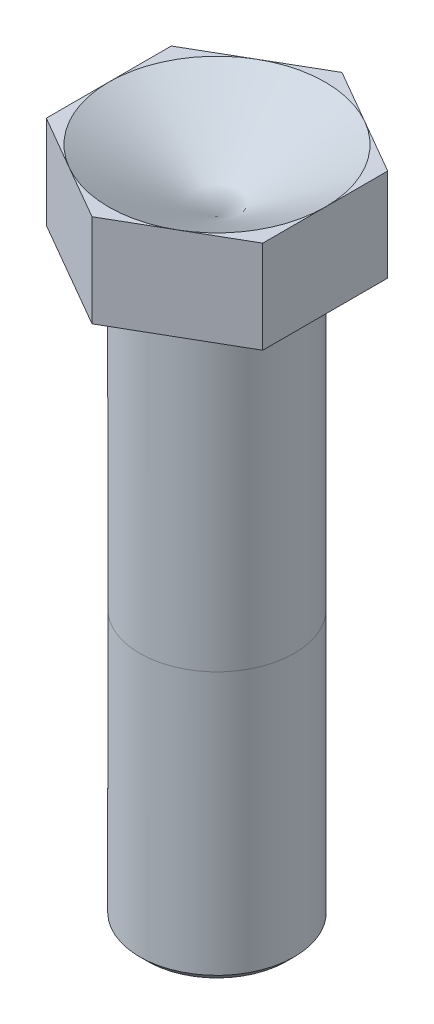
ISO-10303-21;
HEADER;
FILE_DESCRIPTION(('STEP AP214'),'2;1');
FILE_NAME('part.step','',(''),(''),'','','');
FILE_SCHEMA(('AUTOMOTIVE_DESIGN { 1 0 10303 214 1 1 1 1 }'));
ENDSEC;
DATA;
#1=APPLICATION_CONTEXT('core data for automotive mechanical design processes');
#2=APPLICATION_PROTOCOL_DEFINITION('international standard','automotive_design',2000,#1);
#3=PRODUCT_CONTEXT('',#1,'mechanical');
#4=PRODUCT('Part','Part','',(#3));
#5=PRODUCT_RELATED_PRODUCT_CATEGORY('part','',(#4));
#6=PRODUCT_DEFINITION_FORMATION('','',#4);
#7=PRODUCT_DEFINITION_CONTEXT('part definition',#1,'design');
#8=PRODUCT_DEFINITION('design','',#6,#7);
#9=PRODUCT_DEFINITION_SHAPE('','',#8);
#10=(LENGTH_UNIT() NAMED_UNIT(*) SI_UNIT(.MILLI.,.METRE.));
#11=(NAMED_UNIT(*) PLANE_ANGLE_UNIT() SI_UNIT($,.RADIAN.));
#12=(NAMED_UNIT(*) SI_UNIT($,.STERADIAN.) SOLID_ANGLE_UNIT());
#13=UNCERTAINTY_MEASURE_WITH_UNIT(LENGTH_MEASURE(1.E-05),#10,'distance_accuracy_value','');
#14=(GEOMETRIC_REPRESENTATION_CONTEXT(3) GLOBAL_UNCERTAINTY_ASSIGNED_CONTEXT((#13)) GLOBAL_UNIT_ASSIGNED_CONTEXT((#10,
#11,#12)) REPRESENTATION_CONTEXT('',''));
#15=CARTESIAN_POINT('',(0.,0.,0.));
#16=DIRECTION('',(0.,0.,1.));
#17=DIRECTION('',(1.,0.,0.));
#18=AXIS2_PLACEMENT_3D('',#15,#16,#17);
#19=CARTESIAN_POINT('',(0.,-75.,0.));
#20=DIRECTION('',(0.,1.,0.));
#21=DIRECTION('',(0.,0.,1.));
#22=AXIS2_PLACEMENT_3D('',#19,#20,#21);
#23=CYLINDRICAL_SURFACE('',#22,10.);
#24=CARTESIAN_POINT('',(0.,-74.,0.));
#25=DIRECTION('',(0.,-1.,0.));
#26=DIRECTION('',(0.,0.,-1.));
#27=AXIS2_PLACEMENT_3D('',#24,#25,#26);
#28=CIRCLE('',#27,10.);
#29=CARTESIAN_POINT('',(0.,-74.,-10.));
#30=VERTEX_POINT('',#29);
#31=EDGE_CURVE('E222',#30,#30,#28,.F.);
#32=ORIENTED_EDGE('',*,*,#31,.T.);
#33=EDGE_LOOP('',(#32));
#34=FACE_BOUND('',#33,.T.);
#35=CARTESIAN_POINT('',(0.,-40.,0.));
#36=DIRECTION('',(0.,1.,0.));
#37=DIRECTION('',(0.,0.,1.));
#38=AXIS2_PLACEMENT_3D('',#35,#36,#37);
#39=CIRCLE('',#38,10.);
#40=CARTESIAN_POINT('',(10.,-40.,0.));
#41=VERTEX_POINT('',#40);
#42=CARTESIAN_POINT('',(-10.,-40.,0.));
#43=VERTEX_POINT('',#42);
#44=EDGE_CURVE('E13',#41,#43,#39,.T.);
#45=ORIENTED_EDGE('',*,*,#44,.F.);
#46=EDGE_CURVE('E63',#43,#41,#39,.T.);
#47=ORIENTED_EDGE('',*,*,#46,.F.);
#48=EDGE_LOOP('',(#45,#47));
#49=FACE_BOUND('',#48,.T.);
#50=ADVANCED_FACE('F58',(#34,#49),#23,.T.);
#51=CARTESIAN_POINT('',(0.,12.,0.));
#52=DIRECTION('',(0.,1.,0.));
#53=DIRECTION('',(0.,0.,1.));
#54=AXIS2_PLACEMENT_3D('',#51,#52,#53);
#55=PLANE('',#54);
#56=CARTESIAN_POINT('',(0.,12.,0.));
#57=DIRECTION('',(0.,1.,0.));
#58=DIRECTION('',(0.,0.,1.));
#59=AXIS2_PLACEMENT_3D('',#56,#57,#58);
#60=CIRCLE('',#59,14.);
#61=CARTESIAN_POINT('',(7.,12.,12.1243556529821));
#62=VERTEX_POINT('',#61);
#63=CARTESIAN_POINT('',(14.,12.,0.));
#64=VERTEX_POINT('',#63);
#65=EDGE_CURVE('E140',#62,#64,#60,.T.);
#66=ORIENTED_EDGE('',*,*,#65,.F.);
#67=DIRECTION('',(0.866025403784439,0.,-0.5));
#68=VECTOR('',#67,1.);
#69=CARTESIAN_POINT('',(0.,12.,16.1658075373095));
#70=LINE('',#69,#68);
#71=CARTESIAN_POINT('',(14.,12.,8.08290376865476));
#72=VERTEX_POINT('',#71);
#73=EDGE_CURVE('E173',#62,#72,#70,.T.);
#74=ORIENTED_EDGE('',*,*,#73,.T.);
#75=DIRECTION('',(0.,0.,-1.));
#76=VECTOR('',#75,1.);
#77=CARTESIAN_POINT('',(14.,12.,8.08290376865476));
#78=LINE('',#77,#76);
#79=EDGE_CURVE('E167',#72,#64,#78,.T.);
#80=ORIENTED_EDGE('',*,*,#79,.T.);
#81=EDGE_LOOP('',(#66,#74,#80));
#82=FACE_BOUND('',#81,.T.);
#83=ADVANCED_FACE('F172',(#82),#55,.T.);
#84=CARTESIAN_POINT('',(0.,12.,0.));
#85=DIRECTION('',(0.,1.,0.));
#86=DIRECTION('',(0.,0.,1.));
#87=AXIS2_PLACEMENT_3D('',#84,#85,#86);
#88=CIRCLE('',#87,14.);
#89=CARTESIAN_POINT('',(7.,12.,-12.1243556529821));
#90=VERTEX_POINT('',#89);
#91=EDGE_CURVE('E142',#64,#90,#88,.T.);
#92=ORIENTED_EDGE('',*,*,#91,.F.);
#93=CARTESIAN_POINT('',(14.,12.,-8.08290376865476));
#94=VERTEX_POINT('',#93);
#95=EDGE_CURVE('E155',#64,#94,#78,.T.);
#96=ORIENTED_EDGE('',*,*,#95,.T.);
#97=DIRECTION('',(-0.866025403784439,0.,-0.5));
#98=VECTOR('',#97,1.);
#99=CARTESIAN_POINT('',(14.,12.,-8.08290376865476));
#100=LINE('',#99,#98);
#101=EDGE_CURVE('E157',#94,#90,#100,.T.);
#102=ORIENTED_EDGE('',*,*,#101,.T.);
#103=EDGE_LOOP('',(#92,#96,#102));
#104=FACE_BOUND('',#103,.T.);
#105=ADVANCED_FACE('F154',(#104),#55,.T.);
#106=CARTESIAN_POINT('',(-7.,12.,-12.1243556529821));
#107=VERTEX_POINT('',#106);
#108=EDGE_CURVE('E159',#90,#107,#88,.T.);
#109=ORIENTED_EDGE('',*,*,#108,.F.);
#110=CARTESIAN_POINT('',(0.,12.,-16.1658075373095));
#111=VERTEX_POINT('',#110);
#112=EDGE_CURVE('E175',#90,#111,#100,.T.);
#113=ORIENTED_EDGE('',*,*,#112,.T.);
#114=DIRECTION('',(-0.866025403784439,0.,0.5));
#115=VECTOR('',#114,1.);
#116=CARTESIAN_POINT('',(0.,12.,-16.1658075373095));
#117=LINE('',#116,#115);
#118=EDGE_CURVE('E180',#111,#107,#117,.T.);
#119=ORIENTED_EDGE('',*,*,#118,.T.);
#120=EDGE_LOOP('',(#109,#113,#119));
#121=FACE_BOUND('',#120,.T.);
#122=ADVANCED_FACE('F372',(#121),#55,.T.);
#123=CARTESIAN_POINT('',(-14.,12.,0.));
#124=VERTEX_POINT('',#123);
#125=EDGE_CURVE('E400',#107,#124,#88,.T.);
#126=ORIENTED_EDGE('',*,*,#125,.F.);
#127=CARTESIAN_POINT('',(-14.,12.,-8.08290376865475));
#128=VERTEX_POINT('',#127);
#129=EDGE_CURVE('E179',#107,#128,#117,.T.);
#130=ORIENTED_EDGE('',*,*,#129,.T.);
#131=DIRECTION('',(0.,0.,1.));
#132=VECTOR('',#131,1.);
#133=CARTESIAN_POINT('',(-14.,12.,-8.08290376865475));
#134=LINE('',#133,#132);
#135=EDGE_CURVE('E184',#128,#124,#134,.T.);
#136=ORIENTED_EDGE('',*,*,#135,.T.);
#137=EDGE_LOOP('',(#126,#130,#136));
#138=FACE_BOUND('',#137,.T.);
#139=ADVANCED_FACE('F363',(#138),#55,.T.);
#140=CARTESIAN_POINT('',(-7.,12.,12.1243556529821));
#141=VERTEX_POINT('',#140);
#142=EDGE_CURVE('E219',#124,#141,#88,.T.);
#143=ORIENTED_EDGE('',*,*,#142,.F.);
#144=CARTESIAN_POINT('',(-14.,12.,8.08290376865477));
#145=VERTEX_POINT('',#144);
#146=EDGE_CURVE('E183',#124,#145,#134,.T.);
#147=ORIENTED_EDGE('',*,*,#146,.T.);
#148=DIRECTION('',(0.866025403784439,0.,0.5));
#149=VECTOR('',#148,1.);
#150=CARTESIAN_POINT('',(-14.,12.,8.08290376865477));
#151=LINE('',#150,#149);
#152=EDGE_CURVE('E188',#145,#141,#151,.T.);
#153=ORIENTED_EDGE('',*,*,#152,.T.);
#154=EDGE_LOOP('',(#143,#147,#153));
#155=FACE_BOUND('',#154,.T.);
#156=ADVANCED_FACE('F300',(#155),#55,.T.);
#157=CARTESIAN_POINT('',(14.,12.,8.08290376865476));
#158=DIRECTION('',(-1.,0.,0.));
#159=DIRECTION('',(0.,0.,1.));
#160=AXIS2_PLACEMENT_3D('',#157,#158,#159);
#161=PLANE('',#160);
#162=DIRECTION('',(0.,0.,-1.));
#163=VECTOR('',#162,1.);
#164=CARTESIAN_POINT('',(14.,0.,8.08290376865476));
#165=LINE('',#164,#163);
#166=CARTESIAN_POINT('',(14.,0.,8.08290376865476));
#167=VERTEX_POINT('',#166);
#168=CARTESIAN_POINT('',(14.,0.,-8.08290376865476));
#169=VERTEX_POINT('',#168);
#170=EDGE_CURVE('E149',#167,#169,#165,.T.);
#171=ORIENTED_EDGE('',*,*,#170,.T.);
#172=DIRECTION('',(0.,-1.,0.));
#173=VECTOR('',#172,1.);
#174=CARTESIAN_POINT('',(14.,12.,-8.08290376865476));
#175=LINE('',#174,#173);
#176=EDGE_CURVE('E169',#94,#169,#175,.T.);
#177=ORIENTED_EDGE('',*,*,#176,.F.);
#178=ORIENTED_EDGE('',*,*,#95,.F.);
#179=ORIENTED_EDGE('',*,*,#79,.F.);
#180=DIRECTION('',(0.,-1.,0.));
#181=VECTOR('',#180,1.);
#182=CARTESIAN_POINT('',(14.,12.,8.08290376865476));
#183=LINE('',#182,#181);
#184=EDGE_CURVE('E194',#72,#167,#183,.T.);
#185=ORIENTED_EDGE('',*,*,#184,.T.);
#186=EDGE_LOOP('',(#171,#177,#178,#179,#185));
#187=FACE_BOUND('',#186,.T.);
#188=ADVANCED_FACE('F165',(#187),#161,.F.);
#189=CARTESIAN_POINT('',(14.,12.,-8.08290376865476));
#190=DIRECTION('',(-0.5,0.,0.866025403784439));
#191=DIRECTION('',(0.866025403784439,0.,0.5));
#192=AXIS2_PLACEMENT_3D('',#189,#190,#191);
#193=PLANE('',#192);
#194=DIRECTION('',(-0.866025403784439,0.,-0.5));
#195=VECTOR('',#194,1.);
#196=CARTESIAN_POINT('',(14.,0.,-8.08290376865476));
#197=LINE('',#196,#195);
#198=CARTESIAN_POINT('',(0.,0.,-16.1658075373095));
#199=VERTEX_POINT('',#198);
#200=EDGE_CURVE('E196',#169,#199,#197,.T.);
#201=ORIENTED_EDGE('',*,*,#200,.T.);
#202=DIRECTION('',(0.,-1.,0.));
#203=VECTOR('',#202,1.);
#204=CARTESIAN_POINT('',(0.,12.,-16.1658075373095));
#205=LINE('',#204,#203);
#206=EDGE_CURVE('E215',#111,#199,#205,.T.);
#207=ORIENTED_EDGE('',*,*,#206,.F.);
#208=ORIENTED_EDGE('',*,*,#112,.F.);
#209=ORIENTED_EDGE('',*,*,#101,.F.);
#210=ORIENTED_EDGE('',*,*,#176,.T.);
#211=EDGE_LOOP('',(#201,#207,#208,#209,#210));
#212=FACE_BOUND('',#211,.T.);
#213=ADVANCED_FACE('F338',(#212),#193,.F.);
#214=CARTESIAN_POINT('',(0.,12.,-16.1658075373095));
#215=DIRECTION('',(0.5,0.,0.866025403784439));
#216=DIRECTION('',(0.866025403784439,0.,-0.5));
#217=AXIS2_PLACEMENT_3D('',#214,#215,#216);
#218=PLANE('',#217);
#219=DIRECTION('',(-0.866025403784439,0.,0.5));
#220=VECTOR('',#219,1.);
#221=CARTESIAN_POINT('',(0.,0.,-16.1658075373095));
#222=LINE('',#221,#220);
#223=CARTESIAN_POINT('',(-14.,0.,-8.08290376865475));
#224=VERTEX_POINT('',#223);
#225=EDGE_CURVE('E198',#199,#224,#222,.T.);
#226=ORIENTED_EDGE('',*,*,#225,.T.);
#227=DIRECTION('',(0.,-1.,0.));
#228=VECTOR('',#227,1.);
#229=CARTESIAN_POINT('',(-14.,12.,-8.08290376865475));
#230=LINE('',#229,#228);
#231=EDGE_CURVE('E212',#128,#224,#230,.T.);
#232=ORIENTED_EDGE('',*,*,#231,.F.);
#233=ORIENTED_EDGE('',*,*,#129,.F.);
#234=ORIENTED_EDGE('',*,*,#118,.F.);
#235=ORIENTED_EDGE('',*,*,#206,.T.);
#236=EDGE_LOOP('',(#226,#232,#233,#234,#235));
#237=FACE_BOUND('',#236,.T.);
#238=ADVANCED_FACE('F328',(#237),#218,.F.);
#239=CARTESIAN_POINT('',(-14.,12.,-8.08290376865475));
#240=DIRECTION('',(1.,0.,0.));
#241=DIRECTION('',(0.,0.,-1.));
#242=AXIS2_PLACEMENT_3D('',#239,#240,#241);
#243=PLANE('',#242);
#244=DIRECTION('',(0.,0.,1.));
#245=VECTOR('',#244,1.);
#246=CARTESIAN_POINT('',(-14.,0.,-8.08290376865475));
#247=LINE('',#246,#245);
#248=CARTESIAN_POINT('',(-14.,0.,8.08290376865477));
#249=VERTEX_POINT('',#248);
#250=EDGE_CURVE('E200',#224,#249,#247,.T.);
#251=ORIENTED_EDGE('',*,*,#250,.T.);
#252=DIRECTION('',(0.,-1.,0.));
#253=VECTOR('',#252,1.);
#254=CARTESIAN_POINT('',(-14.,12.,8.08290376865477));
#255=LINE('',#254,#253);
#256=EDGE_CURVE('E209',#145,#249,#255,.T.);
#257=ORIENTED_EDGE('',*,*,#256,.F.);
#258=ORIENTED_EDGE('',*,*,#146,.F.);
#259=ORIENTED_EDGE('',*,*,#135,.F.);
#260=ORIENTED_EDGE('',*,*,#231,.T.);
#261=EDGE_LOOP('',(#251,#257,#258,#259,#260));
#262=FACE_BOUND('',#261,.T.);
#263=ADVANCED_FACE('F318',(#262),#243,.F.);
#264=CARTESIAN_POINT('',(-14.,12.,8.08290376865477));
#265=DIRECTION('',(0.5,0.,-0.866025403784439));
#266=DIRECTION('',(-0.866025403784439,0.,-0.5));
#267=AXIS2_PLACEMENT_3D('',#264,#265,#266);
#268=PLANE('',#267);
#269=DIRECTION('',(0.866025403784439,0.,0.5));
#270=VECTOR('',#269,1.);
#271=CARTESIAN_POINT('',(-14.,0.,8.08290376865477));
#272=LINE('',#271,#270);
#273=CARTESIAN_POINT('',(0.,0.,16.1658075373095));
#274=VERTEX_POINT('',#273);
#275=EDGE_CURVE('E202',#249,#274,#272,.T.);
#276=ORIENTED_EDGE('',*,*,#275,.T.);
#277=DIRECTION('',(0.,-1.,0.));
#278=VECTOR('',#277,1.);
#279=CARTESIAN_POINT('',(0.,12.,16.1658075373095));
#280=LINE('',#279,#278);
#281=CARTESIAN_POINT('',(0.,12.,16.1658075373095));
#282=VERTEX_POINT('',#281);
#283=EDGE_CURVE('E206',#282,#274,#280,.T.);
#284=ORIENTED_EDGE('',*,*,#283,.F.);
#285=EDGE_CURVE('E187',#141,#282,#151,.T.);
#286=ORIENTED_EDGE('',*,*,#285,.F.);
#287=ORIENTED_EDGE('',*,*,#152,.F.);
#288=ORIENTED_EDGE('',*,*,#256,.T.);
#289=EDGE_LOOP('',(#276,#284,#286,#287,#288));
#290=FACE_BOUND('',#289,.T.);
#291=ADVANCED_FACE('F308',(#290),#268,.F.);
#292=CARTESIAN_POINT('',(0.,12.,16.1658075373095));
#293=DIRECTION('',(-0.5,0.,-0.866025403784439));
#294=DIRECTION('',(-0.866025403784439,0.,0.5));
#295=AXIS2_PLACEMENT_3D('',#292,#293,#294);
#296=PLANE('',#295);
#297=DIRECTION('',(0.866025403784439,0.,-0.5));
#298=VECTOR('',#297,1.);
#299=CARTESIAN_POINT('',(0.,0.,16.1658075373095));
#300=LINE('',#299,#298);
#301=EDGE_CURVE('E170',#274,#167,#300,.T.);
#302=ORIENTED_EDGE('',*,*,#301,.T.);
#303=ORIENTED_EDGE('',*,*,#184,.F.);
#304=ORIENTED_EDGE('',*,*,#73,.F.);
#305=EDGE_CURVE('E191',#282,#62,#70,.T.);
#306=ORIENTED_EDGE('',*,*,#305,.F.);
#307=ORIENTED_EDGE('',*,*,#283,.T.);
#308=EDGE_LOOP('',(#302,#303,#304,#306,#307));
#309=FACE_BOUND('',#308,.T.);
#310=ADVANCED_FACE('F298',(#309),#296,.F.);
#311=EDGE_CURVE('E145',#141,#62,#88,.T.);
#312=ORIENTED_EDGE('',*,*,#311,.F.);
#313=ORIENTED_EDGE('',*,*,#285,.T.);
#314=ORIENTED_EDGE('',*,*,#305,.T.);
#315=EDGE_LOOP('',(#312,#313,#314));
#316=FACE_BOUND('',#315,.T.);
#317=ADVANCED_FACE('F236',(#316),#55,.T.);
#318=CARTESIAN_POINT('',(0.,0.,0.));
#319=DIRECTION('',(0.,1.,0.));
#320=DIRECTION('',(0.,0.,1.));
#321=AXIS2_PLACEMENT_3D('',#318,#319,#320);
#322=PLANE('',#321);
#323=CARTESIAN_POINT('',(0.,0.,0.));
#324=DIRECTION('',(0.,-1.,0.));
#325=DIRECTION('',(0.,0.,-1.));
#326=AXIS2_PLACEMENT_3D('',#323,#324,#325);
#327=CIRCLE('',#326,10.);
#328=CARTESIAN_POINT('',(0.,0.,-10.));
#329=VERTEX_POINT('',#328);
#330=EDGE_CURVE('E158',#329,#329,#327,.T.);
#331=ORIENTED_EDGE('',*,*,#330,.F.);
#332=EDGE_LOOP('',(#331));
#333=FACE_BOUND('',#332,.T.);
#334=ORIENTED_EDGE('',*,*,#170,.F.);
#335=ORIENTED_EDGE('',*,*,#301,.F.);
#336=ORIENTED_EDGE('',*,*,#275,.F.);
#337=ORIENTED_EDGE('',*,*,#250,.F.);
#338=ORIENTED_EDGE('',*,*,#225,.F.);
#339=ORIENTED_EDGE('',*,*,#200,.F.);
#340=EDGE_LOOP('',(#334,#335,#336,#337,#338,#339));
#341=FACE_BOUND('',#340,.T.);
#342=ADVANCED_FACE('F137',(#333,#341),#322,.F.);
#343=CARTESIAN_POINT('',(0.,12.,0.));
#344=DIRECTION('',(0.,1.,0.));
#345=DIRECTION('',(0.,0.,1.));
#346=AXIS2_PLACEMENT_3D('',#343,#344,#345);
#347=CONICAL_SURFACE('',#346,14.,1.0471975511966);
#348=CARTESIAN_POINT('',(0.,3.91709623134528,0.));
#349=VERTEX_POINT('',#348);
#350=VERTEX_LOOP('',#349);
#351=FACE_BOUND('',#350,.T.);
#352=ORIENTED_EDGE('',*,*,#65,.T.);
#353=ORIENTED_EDGE('',*,*,#91,.T.);
#354=ORIENTED_EDGE('',*,*,#108,.T.);
#355=ORIENTED_EDGE('',*,*,#125,.T.);
#356=ORIENTED_EDGE('',*,*,#142,.T.);
#357=ORIENTED_EDGE('',*,*,#311,.T.);
#358=EDGE_LOOP('',(#352,#353,#354,#355,#356,#357));
#359=FACE_BOUND('',#358,.T.);
#360=ADVANCED_FACE('F133',(#351,#359),#347,.F.);
#361=ORIENTED_EDGE('',*,*,#46,.T.);
#362=ORIENTED_EDGE('',*,*,#44,.T.);
#363=EDGE_LOOP('',(#361,#362));
#364=FACE_BOUND('',#363,.T.);
#365=ORIENTED_EDGE('',*,*,#330,.T.);
#366=EDGE_LOOP('',(#365));
#367=FACE_BOUND('',#366,.T.);
#368=ADVANCED_FACE('F136',(#364,#367),#23,.T.);
#369=CARTESIAN_POINT('',(0.,-75.,0.));
#370=DIRECTION('',(0.,-1.,0.));
#371=DIRECTION('',(0.,0.,-1.));
#372=AXIS2_PLACEMENT_3D('',#369,#370,#371);
#373=PLANE('',#372);
#374=CARTESIAN_POINT('',(0.,-75.,0.));
#375=DIRECTION('',(0.,-1.,0.));
#376=DIRECTION('',(0.,0.,-1.));
#377=AXIS2_PLACEMENT_3D('',#374,#375,#376);
#378=CIRCLE('',#377,8.99999999999999);
#379=CARTESIAN_POINT('',(0.,-75.,-8.99999999999999));
#380=VERTEX_POINT('',#379);
#381=EDGE_CURVE('E220',#380,#380,#378,.T.);
#382=ORIENTED_EDGE('',*,*,#381,.T.);
#383=EDGE_LOOP('',(#382));
#384=FACE_BOUND('',#383,.T.);
#385=ADVANCED_FACE('F239',(#384),#373,.T.);
#386=CARTESIAN_POINT('',(0.,-75.,0.));
#387=DIRECTION('',(0.,1.,0.));
#388=DIRECTION('',(0.,0.,1.));
#389=AXIS2_PLACEMENT_3D('',#386,#387,#388);
#390=CONICAL_SURFACE('',#389,8.99999999999999,0.785398163397451);
#391=ORIENTED_EDGE('',*,*,#31,.F.);
#392=EDGE_LOOP('',(#391));
#393=FACE_BOUND('',#392,.T.);
#394=ORIENTED_EDGE('',*,*,#381,.F.);
#395=EDGE_LOOP('',(#394));
#396=FACE_BOUND('',#395,.T.);
#397=ADVANCED_FACE('F61',(#393,#396),#390,.T.);
#398=CLOSED_SHELL('',(#50,#83,#105,#122,#139,#156,#188,#213,#238,#263,#291,#310,#317,#342,#360,
#368,#385,#397));
#399=MANIFOLD_SOLID_BREP('B2',#398);
#400=ADVANCED_BREP_SHAPE_REPRESENTATION('',(#18,#399),#14);
#401=SHAPE_DEFINITION_REPRESENTATION(#9,#400);
ENDSEC;
END-ISO-10303-21;
